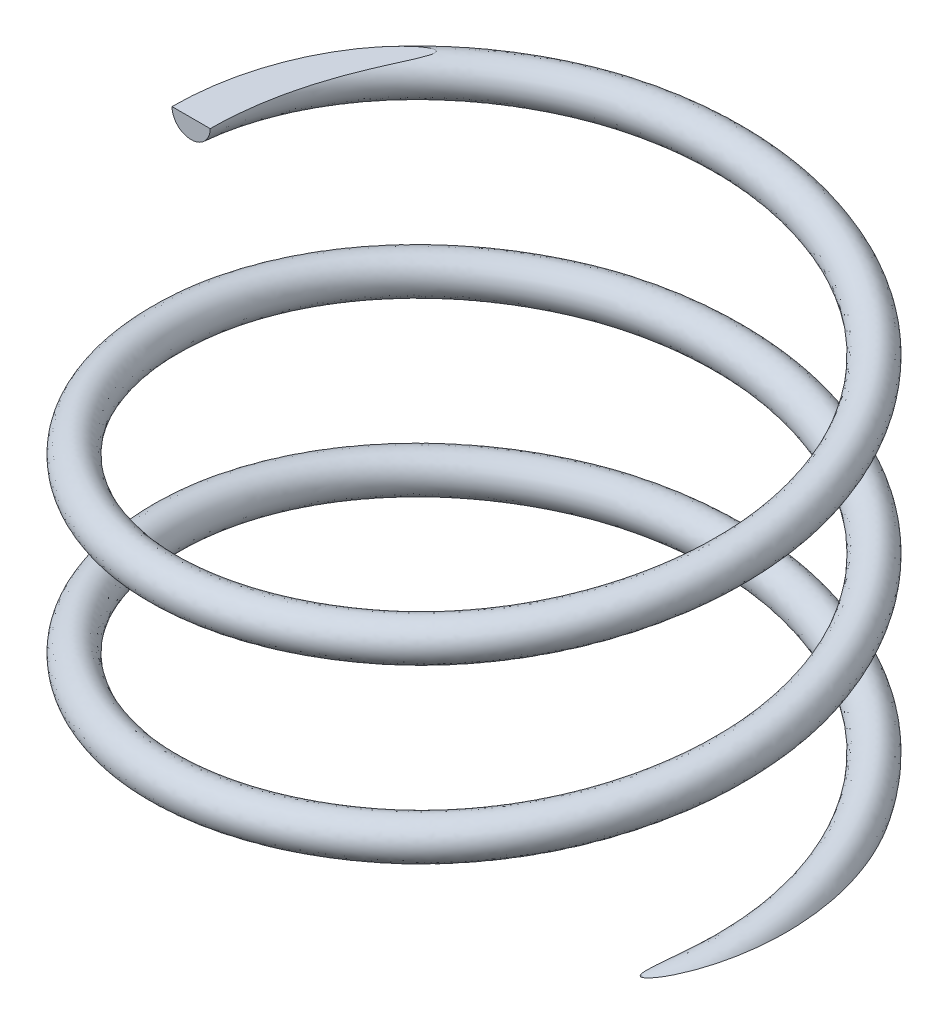
ISO-10303-21;
HEADER;
FILE_DESCRIPTION(('STEP AP214'),'2;1');
FILE_NAME('part.step','',(''),(''),'','','');
FILE_SCHEMA(('AUTOMOTIVE_DESIGN { 1 0 10303 214 1 1 1 1 }'));
ENDSEC;
DATA;
#1=APPLICATION_CONTEXT('core data for automotive mechanical design processes');
#2=APPLICATION_PROTOCOL_DEFINITION('international standard','automotive_design',2000,#1);
#3=PRODUCT_CONTEXT('',#1,'mechanical');
#4=PRODUCT('Part','Part','',(#3));
#5=PRODUCT_RELATED_PRODUCT_CATEGORY('part','',(#4));
#6=PRODUCT_DEFINITION_FORMATION('','',#4);
#7=PRODUCT_DEFINITION_CONTEXT('part definition',#1,'design');
#8=PRODUCT_DEFINITION('design','',#6,#7);
#9=PRODUCT_DEFINITION_SHAPE('','',#8);
#10=(LENGTH_UNIT() NAMED_UNIT(*) SI_UNIT(.MILLI.,.METRE.));
#11=(NAMED_UNIT(*) PLANE_ANGLE_UNIT() SI_UNIT($,.RADIAN.));
#12=(NAMED_UNIT(*) SI_UNIT($,.STERADIAN.) SOLID_ANGLE_UNIT());
#13=UNCERTAINTY_MEASURE_WITH_UNIT(LENGTH_MEASURE(1.E-05),#10,'distance_accuracy_value','');
#14=(GEOMETRIC_REPRESENTATION_CONTEXT(3) GLOBAL_UNCERTAINTY_ASSIGNED_CONTEXT((#13)) GLOBAL_UNIT_ASSIGNED_CONTEXT((#10,
#11,#12)) REPRESENTATION_CONTEXT('',''));
#15=CARTESIAN_POINT('',(0.,0.,0.));
#16=DIRECTION('',(0.,0.,1.));
#17=DIRECTION('',(1.,0.,0.));
#18=AXIS2_PLACEMENT_3D('',#15,#16,#17);
#19=CARTESIAN_POINT('',(0.,9.,2.06695695259513E-13));
#20=DIRECTION('',(0.,0.,1.));
#21=DIRECTION('',(1.,0.,0.));
#22=AXIS2_PLACEMENT_3D('',#19,#20,#21);
#23=PLANE('',#22);
#24=CARTESIAN_POINT('',(0.,9.,2.06695695259513E-13));
#25=DIRECTION('',(0.,0.,1.));
#26=DIRECTION('',(1.,0.,0.));
#27=AXIS2_PLACEMENT_3D('',#24,#25,#26);
#28=CIRCLE('',#27,0.25);
#29=CARTESIAN_POINT('',(-0.25,9.,0.));
#30=VERTEX_POINT('',#29);
#31=CARTESIAN_POINT('',(0.25,9.,1.92729769904141E-13));
#32=VERTEX_POINT('',#31);
#33=EDGE_CURVE('E65',#30,#32,#28,.T.);
#34=ORIENTED_EDGE('',*,*,#33,.T.);
#35=DIRECTION('',(-1.,0.,0.));
#36=VECTOR('',#35,1.);
#37=CARTESIAN_POINT('',(0.,9.,2.06695695259513E-13));
#38=LINE('',#37,#36);
#39=EDGE_CURVE('E59',#32,#30,#38,.T.);
#40=ORIENTED_EDGE('',*,*,#39,.T.);
#41=EDGE_LOOP('',(#34,#40));
#42=FACE_BOUND('',#41,.T.);
#43=ADVANCED_FACE('F42',(#42),#23,.T.);
#44=CARTESIAN_POINT('',(0.25,0.,0.));
#45=CARTESIAN_POINT('',(0.25,0.1875,1.99185842870421));
#46=CARTESIAN_POINT('',(1.975,0.374999999999999,2.98778764305631));
#47=CARTESIAN_POINT('',(3.7,0.562499999999999,3.98371685740842));
#48=CARTESIAN_POINT('',(5.425,0.749999999999998,2.98778764305631));
#49=CARTESIAN_POINT('',(7.15,0.937499999999998,1.99185842870421));
#50=CARTESIAN_POINT('',(7.15,1.125,0.));
#51=CARTESIAN_POINT('',(7.15,1.3125,-1.99185842870421));
#52=CARTESIAN_POINT('',(5.425,1.5,-2.98778764305631));
#53=CARTESIAN_POINT('',(3.7,1.6875,-3.98371685740842));
#54=CARTESIAN_POINT('',(1.975,1.875,-2.98778764305631));
#55=CARTESIAN_POINT('',(0.250000000000001,2.06249999999999,-1.99185842870421));
#56=CARTESIAN_POINT('',(0.25,2.24999999999999,0.));
#57=CARTESIAN_POINT('',(0.25,2.43749999999999,1.99185842870421));
#58=CARTESIAN_POINT('',(1.975,2.62499999999999,2.98778764305631));
#59=CARTESIAN_POINT('',(3.7,2.81249999999999,3.98371685740842));
#60=CARTESIAN_POINT('',(5.425,2.99999999999999,2.98778764305631));
#61=CARTESIAN_POINT('',(7.15,3.18749999999999,1.99185842870421));
#62=CARTESIAN_POINT('',(7.15,3.37499999999999,0.));
#63=CARTESIAN_POINT('',(7.15,3.56249999999999,-1.99185842870421));
#64=CARTESIAN_POINT('',(5.425,3.74999999999999,-2.98778764305631));
#65=CARTESIAN_POINT('',(3.7,3.93749999999999,-3.98371685740842));
#66=CARTESIAN_POINT('',(1.975,4.12499999999999,-2.98778764305631));
#67=CARTESIAN_POINT('',(0.250000000000001,4.31249999999999,-1.99185842870421));
#68=CARTESIAN_POINT('',(0.25,4.49999999999999,0.));
#69=CARTESIAN_POINT('',(0.25,4.68749999999999,1.99185842870421));
#70=CARTESIAN_POINT('',(1.975,4.87499999999999,2.98778764305631));
#71=CARTESIAN_POINT('',(3.7,5.06249999999999,3.98371685740842));
#72=CARTESIAN_POINT('',(5.425,5.24999999999999,2.98778764305631));
#73=CARTESIAN_POINT('',(7.15,5.43749999999999,1.99185842870421));
#74=CARTESIAN_POINT('',(7.15,5.62499999999999,0.));
#75=CARTESIAN_POINT('',(7.15,5.81249999999999,-1.99185842870421));
#76=CARTESIAN_POINT('',(5.425,5.99999999999999,-2.98778764305631));
#77=CARTESIAN_POINT('',(3.7,6.18749999999998,-3.98371685740842));
#78=CARTESIAN_POINT('',(1.975,6.37499999999998,-2.98778764305631));
#79=CARTESIAN_POINT('',(0.250000000000001,6.56249999999998,-1.99185842870421));
#80=CARTESIAN_POINT('',(0.25,6.74999999999998,0.));
#81=CARTESIAN_POINT('',(0.25,6.93749999999998,1.99185842870421));
#82=CARTESIAN_POINT('',(1.975,7.12499999999998,2.98778764305631));
#83=CARTESIAN_POINT('',(3.7,7.31249999999998,3.98371685740842));
#84=CARTESIAN_POINT('',(5.425,7.49999999999998,2.98778764305631));
#85=CARTESIAN_POINT('',(7.15,7.68749999999998,1.99185842870421));
#86=CARTESIAN_POINT('',(7.15,7.87499999999998,0.));
#87=CARTESIAN_POINT('',(7.15,8.06249999999998,-1.99185842870421));
#88=CARTESIAN_POINT('',(5.425,8.24999999999998,-2.98778764305631));
#89=CARTESIAN_POINT('',(3.7,8.43749999999998,-3.98371685740842));
#90=CARTESIAN_POINT('',(1.975,8.62499999999998,-2.98778764305631));
#91=CARTESIAN_POINT('',(0.250000000000001,8.81249999999998,-1.99185842870421));
#92=CARTESIAN_POINT('',(0.25,8.99999999999998,0.));
#93=CARTESIAN_POINT('',(0.25,0.5,0.));
#94=CARTESIAN_POINT('',(0.25,0.687499999999999,1.99185842870421));
#95=CARTESIAN_POINT('',(1.975,0.874999999999999,2.98778764305631));
#96=CARTESIAN_POINT('',(3.7,1.0625,3.98371685740842));
#97=CARTESIAN_POINT('',(5.425,1.25,2.98778764305631));
#98=CARTESIAN_POINT('',(7.15,1.4375,1.99185842870421));
#99=CARTESIAN_POINT('',(7.15,1.625,0.));
#100=CARTESIAN_POINT('',(7.15,1.8125,-1.99185842870421));
#101=CARTESIAN_POINT('',(5.425,2.,-2.98778764305631));
#102=CARTESIAN_POINT('',(3.7,2.1875,-3.98371685740842));
#103=CARTESIAN_POINT('',(1.975,2.375,-2.98778764305631));
#104=CARTESIAN_POINT('',(0.250000000000001,2.5625,-1.99185842870421));
#105=CARTESIAN_POINT('',(0.25,2.74999999999999,0.));
#106=CARTESIAN_POINT('',(0.25,2.93749999999999,1.99185842870421));
#107=CARTESIAN_POINT('',(1.975,3.12499999999999,2.98778764305631));
#108=CARTESIAN_POINT('',(3.7,3.31249999999999,3.98371685740842));
#109=CARTESIAN_POINT('',(5.425,3.49999999999999,2.98778764305631));
#110=CARTESIAN_POINT('',(7.15,3.68749999999999,1.99185842870421));
#111=CARTESIAN_POINT('',(7.15,3.87499999999999,0.));
#112=CARTESIAN_POINT('',(7.15,4.06249999999999,-1.99185842870421));
#113=CARTESIAN_POINT('',(5.425,4.24999999999999,-2.98778764305631));
#114=CARTESIAN_POINT('',(3.7,4.43749999999999,-3.98371685740842));
#115=CARTESIAN_POINT('',(1.975,4.62499999999999,-2.98778764305631));
#116=CARTESIAN_POINT('',(0.250000000000001,4.81249999999999,-1.99185842870421));
#117=CARTESIAN_POINT('',(0.25,4.99999999999999,0.));
#118=CARTESIAN_POINT('',(0.25,5.18749999999999,1.99185842870421));
#119=CARTESIAN_POINT('',(1.975,5.37499999999999,2.98778764305631));
#120=CARTESIAN_POINT('',(3.7,5.56249999999999,3.98371685740842));
#121=CARTESIAN_POINT('',(5.425,5.74999999999999,2.98778764305631));
#122=CARTESIAN_POINT('',(7.15,5.93749999999999,1.99185842870421));
#123=CARTESIAN_POINT('',(7.15,6.12499999999999,0.));
#124=CARTESIAN_POINT('',(7.15,6.31249999999999,-1.99185842870421));
#125=CARTESIAN_POINT('',(5.425,6.49999999999998,-2.98778764305631));
#126=CARTESIAN_POINT('',(3.7,6.68749999999998,-3.98371685740842));
#127=CARTESIAN_POINT('',(1.975,6.87499999999998,-2.98778764305631));
#128=CARTESIAN_POINT('',(0.250000000000001,7.06249999999998,-1.99185842870421));
#129=CARTESIAN_POINT('',(0.25,7.24999999999998,0.));
#130=CARTESIAN_POINT('',(0.25,7.43749999999998,1.99185842870421));
#131=CARTESIAN_POINT('',(1.975,7.62499999999998,2.98778764305631));
#132=CARTESIAN_POINT('',(3.7,7.81249999999998,3.98371685740842));
#133=CARTESIAN_POINT('',(5.425,7.99999999999998,2.98778764305631));
#134=CARTESIAN_POINT('',(7.15,8.18749999999998,1.99185842870421));
#135=CARTESIAN_POINT('',(7.15,8.37499999999998,0.));
#136=CARTESIAN_POINT('',(7.15,8.56249999999998,-1.99185842870421));
#137=CARTESIAN_POINT('',(5.425,8.74999999999998,-2.98778764305631));
#138=CARTESIAN_POINT('',(3.7,8.93749999999998,-3.98371685740842));
#139=CARTESIAN_POINT('',(1.975,9.12499999999998,-2.98778764305631));
#140=CARTESIAN_POINT('',(0.250000000000001,9.31249999999998,-1.99185842870421));
#141=CARTESIAN_POINT('',(0.25,9.49999999999998,0.));
#142=CARTESIAN_POINT('',(-0.25,0.5,0.));
#143=CARTESIAN_POINT('',(-0.25,0.687499999999999,2.28053356329902));
#144=CARTESIAN_POINT('',(1.725,0.874999999999999,3.42080034494853));
#145=CARTESIAN_POINT('',(3.7,1.0625,4.56106712659804));
#146=CARTESIAN_POINT('',(5.675,1.25,3.42080034494853));
#147=CARTESIAN_POINT('',(7.65,1.4375,2.28053356329902));
#148=CARTESIAN_POINT('',(7.65,1.625,0.));
#149=CARTESIAN_POINT('',(7.65,1.8125,-2.28053356329902));
#150=CARTESIAN_POINT('',(5.675,2.,-3.42080034494853));
#151=CARTESIAN_POINT('',(3.7,2.1875,-4.56106712659804));
#152=CARTESIAN_POINT('',(1.725,2.375,-3.42080034494853));
#153=CARTESIAN_POINT('',(-0.249999999999999,2.5625,-2.28053356329902));
#154=CARTESIAN_POINT('',(-0.25,2.74999999999999,0.));
#155=CARTESIAN_POINT('',(-0.25,2.93749999999999,2.28053356329902));
#156=CARTESIAN_POINT('',(1.725,3.12499999999999,3.42080034494853));
#157=CARTESIAN_POINT('',(3.7,3.31249999999999,4.56106712659804));
#158=CARTESIAN_POINT('',(5.675,3.49999999999999,3.42080034494853));
#159=CARTESIAN_POINT('',(7.65,3.68749999999999,2.28053356329902));
#160=CARTESIAN_POINT('',(7.65,3.87499999999999,0.));
#161=CARTESIAN_POINT('',(7.65,4.06249999999999,-2.28053356329902));
#162=CARTESIAN_POINT('',(5.675,4.24999999999999,-3.42080034494853));
#163=CARTESIAN_POINT('',(3.7,4.43749999999999,-4.56106712659804));
#164=CARTESIAN_POINT('',(1.725,4.62499999999999,-3.42080034494853));
#165=CARTESIAN_POINT('',(-0.249999999999999,4.81249999999999,-2.28053356329902));
#166=CARTESIAN_POINT('',(-0.25,4.99999999999999,0.));
#167=CARTESIAN_POINT('',(-0.25,5.18749999999999,2.28053356329902));
#168=CARTESIAN_POINT('',(1.725,5.37499999999999,3.42080034494853));
#169=CARTESIAN_POINT('',(3.7,5.56249999999999,4.56106712659804));
#170=CARTESIAN_POINT('',(5.675,5.74999999999999,3.42080034494853));
#171=CARTESIAN_POINT('',(7.65,5.93749999999999,2.28053356329902));
#172=CARTESIAN_POINT('',(7.65,6.12499999999999,0.));
#173=CARTESIAN_POINT('',(7.65,6.31249999999999,-2.28053356329902));
#174=CARTESIAN_POINT('',(5.675,6.49999999999998,-3.42080034494853));
#175=CARTESIAN_POINT('',(3.7,6.68749999999998,-4.56106712659804));
#176=CARTESIAN_POINT('',(1.725,6.87499999999998,-3.42080034494853));
#177=CARTESIAN_POINT('',(-0.249999999999999,7.06249999999998,-2.28053356329902));
#178=CARTESIAN_POINT('',(-0.25,7.24999999999998,0.));
#179=CARTESIAN_POINT('',(-0.25,7.43749999999998,2.28053356329902));
#180=CARTESIAN_POINT('',(1.725,7.62499999999998,3.42080034494853));
#181=CARTESIAN_POINT('',(3.7,7.81249999999998,4.56106712659804));
#182=CARTESIAN_POINT('',(5.675,7.99999999999998,3.42080034494853));
#183=CARTESIAN_POINT('',(7.65,8.18749999999998,2.28053356329902));
#184=CARTESIAN_POINT('',(7.65,8.37499999999998,0.));
#185=CARTESIAN_POINT('',(7.65,8.56249999999998,-2.28053356329902));
#186=CARTESIAN_POINT('',(5.675,8.74999999999998,-3.42080034494853));
#187=CARTESIAN_POINT('',(3.7,8.93749999999998,-4.56106712659804));
#188=CARTESIAN_POINT('',(1.725,9.12499999999998,-3.42080034494853));
#189=CARTESIAN_POINT('',(-0.249999999999999,9.31249999999998,-2.28053356329902));
#190=CARTESIAN_POINT('',(-0.25,9.49999999999998,0.));
#191=CARTESIAN_POINT('',(-0.25,0.,0.));
#192=CARTESIAN_POINT('',(-0.25,0.1875,2.28053356329902));
#193=CARTESIAN_POINT('',(1.725,0.374999999999999,3.42080034494853));
#194=CARTESIAN_POINT('',(3.7,0.562499999999999,4.56106712659804));
#195=CARTESIAN_POINT('',(5.675,0.749999999999998,3.42080034494853));
#196=CARTESIAN_POINT('',(7.65,0.937499999999998,2.28053356329902));
#197=CARTESIAN_POINT('',(7.65,1.125,0.));
#198=CARTESIAN_POINT('',(7.65,1.3125,-2.28053356329902));
#199=CARTESIAN_POINT('',(5.675,1.5,-3.42080034494853));
#200=CARTESIAN_POINT('',(3.7,1.6875,-4.56106712659804));
#201=CARTESIAN_POINT('',(1.725,1.875,-3.42080034494853));
#202=CARTESIAN_POINT('',(-0.249999999999999,2.06249999999999,-2.28053356329902));
#203=CARTESIAN_POINT('',(-0.25,2.24999999999999,0.));
#204=CARTESIAN_POINT('',(-0.25,2.43749999999999,2.28053356329902));
#205=CARTESIAN_POINT('',(1.725,2.62499999999999,3.42080034494853));
#206=CARTESIAN_POINT('',(3.7,2.81249999999999,4.56106712659804));
#207=CARTESIAN_POINT('',(5.675,2.99999999999999,3.42080034494853));
#208=CARTESIAN_POINT('',(7.65,3.18749999999999,2.28053356329902));
#209=CARTESIAN_POINT('',(7.65,3.37499999999999,0.));
#210=CARTESIAN_POINT('',(7.65,3.56249999999999,-2.28053356329902));
#211=CARTESIAN_POINT('',(5.675,3.74999999999999,-3.42080034494853));
#212=CARTESIAN_POINT('',(3.7,3.93749999999999,-4.56106712659804));
#213=CARTESIAN_POINT('',(1.725,4.12499999999999,-3.42080034494853));
#214=CARTESIAN_POINT('',(-0.249999999999999,4.31249999999999,-2.28053356329902));
#215=CARTESIAN_POINT('',(-0.25,4.49999999999999,0.));
#216=CARTESIAN_POINT('',(-0.25,4.68749999999999,2.28053356329902));
#217=CARTESIAN_POINT('',(1.725,4.87499999999999,3.42080034494853));
#218=CARTESIAN_POINT('',(3.7,5.06249999999999,4.56106712659804));
#219=CARTESIAN_POINT('',(5.675,5.24999999999999,3.42080034494853));
#220=CARTESIAN_POINT('',(7.65,5.43749999999999,2.28053356329902));
#221=CARTESIAN_POINT('',(7.65,5.62499999999999,0.));
#222=CARTESIAN_POINT('',(7.65,5.81249999999999,-2.28053356329902));
#223=CARTESIAN_POINT('',(5.675,5.99999999999999,-3.42080034494853));
#224=CARTESIAN_POINT('',(3.7,6.18749999999998,-4.56106712659804));
#225=CARTESIAN_POINT('',(1.725,6.37499999999998,-3.42080034494853));
#226=CARTESIAN_POINT('',(-0.249999999999999,6.56249999999998,-2.28053356329902));
#227=CARTESIAN_POINT('',(-0.25,6.74999999999998,0.));
#228=CARTESIAN_POINT('',(-0.25,6.93749999999998,2.28053356329902));
#229=CARTESIAN_POINT('',(1.725,7.12499999999998,3.42080034494853));
#230=CARTESIAN_POINT('',(3.7,7.31249999999998,4.56106712659804));
#231=CARTESIAN_POINT('',(5.675,7.49999999999998,3.42080034494853));
#232=CARTESIAN_POINT('',(7.65,7.68749999999998,2.28053356329902));
#233=CARTESIAN_POINT('',(7.65,7.87499999999998,0.));
#234=CARTESIAN_POINT('',(7.65,8.06249999999998,-2.28053356329902));
#235=CARTESIAN_POINT('',(5.675,8.24999999999998,-3.42080034494853));
#236=CARTESIAN_POINT('',(3.7,8.43749999999998,-4.56106712659804));
#237=CARTESIAN_POINT('',(1.725,8.62499999999998,-3.42080034494853));
#238=CARTESIAN_POINT('',(-0.249999999999999,8.81249999999998,-2.28053356329902));
#239=CARTESIAN_POINT('',(-0.25,8.99999999999998,0.));
#240=CARTESIAN_POINT('',(-0.25,-0.5,0.));
#241=CARTESIAN_POINT('',(-0.25,-0.3125,2.28053356329902));
#242=CARTESIAN_POINT('',(1.725,-0.125000000000001,3.42080034494853));
#243=CARTESIAN_POINT('',(3.7,0.0624999999999988,4.56106712659804));
#244=CARTESIAN_POINT('',(5.675,0.249999999999998,3.42080034494853));
#245=CARTESIAN_POINT('',(7.65,0.437499999999998,2.28053356329902));
#246=CARTESIAN_POINT('',(7.65,0.624999999999997,0.));
#247=CARTESIAN_POINT('',(7.65,0.812499999999997,-2.28053356329902));
#248=CARTESIAN_POINT('',(5.675,0.999999999999997,-3.42080034494853));
#249=CARTESIAN_POINT('',(3.7,1.1875,-4.56106712659804));
#250=CARTESIAN_POINT('',(1.725,1.375,-3.42080034494853));
#251=CARTESIAN_POINT('',(-0.249999999999999,1.5625,-2.28053356329902));
#252=CARTESIAN_POINT('',(-0.25,1.74999999999999,0.));
#253=CARTESIAN_POINT('',(-0.25,1.93749999999999,2.28053356329902));
#254=CARTESIAN_POINT('',(1.725,2.12499999999999,3.42080034494853));
#255=CARTESIAN_POINT('',(3.7,2.31249999999999,4.56106712659804));
#256=CARTESIAN_POINT('',(5.675,2.49999999999999,3.42080034494853));
#257=CARTESIAN_POINT('',(7.65,2.68749999999999,2.28053356329902));
#258=CARTESIAN_POINT('',(7.65,2.87499999999999,0.));
#259=CARTESIAN_POINT('',(7.65,3.06249999999999,-2.28053356329902));
#260=CARTESIAN_POINT('',(5.675,3.24999999999999,-3.42080034494853));
#261=CARTESIAN_POINT('',(3.7,3.43749999999999,-4.56106712659804));
#262=CARTESIAN_POINT('',(1.725,3.62499999999999,-3.42080034494853));
#263=CARTESIAN_POINT('',(-0.249999999999999,3.81249999999999,-2.28053356329902));
#264=CARTESIAN_POINT('',(-0.25,3.99999999999999,0.));
#265=CARTESIAN_POINT('',(-0.25,4.18749999999999,2.28053356329902));
#266=CARTESIAN_POINT('',(1.725,4.37499999999999,3.42080034494853));
#267=CARTESIAN_POINT('',(3.7,4.56249999999999,4.56106712659804));
#268=CARTESIAN_POINT('',(5.675,4.74999999999999,3.42080034494853));
#269=CARTESIAN_POINT('',(7.65,4.93749999999999,2.28053356329902));
#270=CARTESIAN_POINT('',(7.65,5.12499999999999,0.));
#271=CARTESIAN_POINT('',(7.65,5.31249999999999,-2.28053356329902));
#272=CARTESIAN_POINT('',(5.675,5.49999999999999,-3.42080034494853));
#273=CARTESIAN_POINT('',(3.7,5.68749999999998,-4.56106712659804));
#274=CARTESIAN_POINT('',(1.725,5.87499999999999,-3.42080034494853));
#275=CARTESIAN_POINT('',(-0.249999999999999,6.06249999999999,-2.28053356329902));
#276=CARTESIAN_POINT('',(-0.25,6.24999999999998,0.));
#277=CARTESIAN_POINT('',(-0.25,6.43749999999998,2.28053356329902));
#278=CARTESIAN_POINT('',(1.725,6.62499999999998,3.42080034494853));
#279=CARTESIAN_POINT('',(3.7,6.81249999999998,4.56106712659804));
#280=CARTESIAN_POINT('',(5.675,6.99999999999998,3.42080034494853));
#281=CARTESIAN_POINT('',(7.65,7.18749999999998,2.28053356329902));
#282=CARTESIAN_POINT('',(7.65,7.37499999999998,0.));
#283=CARTESIAN_POINT('',(7.65,7.56249999999998,-2.28053356329902));
#284=CARTESIAN_POINT('',(5.675,7.74999999999998,-3.42080034494853));
#285=CARTESIAN_POINT('',(3.7,7.93749999999998,-4.56106712659804));
#286=CARTESIAN_POINT('',(1.725,8.12499999999998,-3.42080034494853));
#287=CARTESIAN_POINT('',(-0.249999999999999,8.31249999999998,-2.28053356329902));
#288=CARTESIAN_POINT('',(-0.25,8.49999999999998,0.));
#289=CARTESIAN_POINT('',(0.25,-0.5,0.));
#290=CARTESIAN_POINT('',(0.25,-0.3125,1.99185842870421));
#291=CARTESIAN_POINT('',(1.975,-0.125000000000001,2.98778764305631));
#292=CARTESIAN_POINT('',(3.7,0.0624999999999988,3.98371685740842));
#293=CARTESIAN_POINT('',(5.425,0.249999999999998,2.98778764305631));
#294=CARTESIAN_POINT('',(7.15,0.437499999999998,1.99185842870421));
#295=CARTESIAN_POINT('',(7.15,0.624999999999997,0.));
#296=CARTESIAN_POINT('',(7.15,0.812499999999997,-1.99185842870421));
#297=CARTESIAN_POINT('',(5.425,0.999999999999997,-2.98778764305631));
#298=CARTESIAN_POINT('',(3.7,1.1875,-3.98371685740842));
#299=CARTESIAN_POINT('',(1.975,1.375,-2.98778764305631));
#300=CARTESIAN_POINT('',(0.250000000000001,1.5625,-1.99185842870421));
#301=CARTESIAN_POINT('',(0.25,1.74999999999999,0.));
#302=CARTESIAN_POINT('',(0.25,1.93749999999999,1.99185842870421));
#303=CARTESIAN_POINT('',(1.975,2.12499999999999,2.98778764305631));
#304=CARTESIAN_POINT('',(3.7,2.31249999999999,3.98371685740842));
#305=CARTESIAN_POINT('',(5.425,2.49999999999999,2.98778764305631));
#306=CARTESIAN_POINT('',(7.15,2.68749999999999,1.99185842870421));
#307=CARTESIAN_POINT('',(7.15,2.87499999999999,0.));
#308=CARTESIAN_POINT('',(7.15,3.06249999999999,-1.99185842870421));
#309=CARTESIAN_POINT('',(5.425,3.24999999999999,-2.98778764305631));
#310=CARTESIAN_POINT('',(3.7,3.43749999999999,-3.98371685740842));
#311=CARTESIAN_POINT('',(1.975,3.62499999999999,-2.98778764305631));
#312=CARTESIAN_POINT('',(0.250000000000001,3.81249999999999,-1.99185842870421));
#313=CARTESIAN_POINT('',(0.25,3.99999999999999,0.));
#314=CARTESIAN_POINT('',(0.25,4.18749999999999,1.99185842870421));
#315=CARTESIAN_POINT('',(1.975,4.37499999999999,2.98778764305631));
#316=CARTESIAN_POINT('',(3.7,4.56249999999999,3.98371685740842));
#317=CARTESIAN_POINT('',(5.425,4.74999999999999,2.98778764305631));
#318=CARTESIAN_POINT('',(7.15,4.93749999999999,1.99185842870421));
#319=CARTESIAN_POINT('',(7.15,5.12499999999999,0.));
#320=CARTESIAN_POINT('',(7.15,5.31249999999999,-1.99185842870421));
#321=CARTESIAN_POINT('',(5.425,5.49999999999999,-2.98778764305631));
#322=CARTESIAN_POINT('',(3.7,5.68749999999998,-3.98371685740842));
#323=CARTESIAN_POINT('',(1.975,5.87499999999999,-2.98778764305631));
#324=CARTESIAN_POINT('',(0.250000000000001,6.06249999999999,-1.99185842870421));
#325=CARTESIAN_POINT('',(0.25,6.24999999999998,0.));
#326=CARTESIAN_POINT('',(0.25,6.43749999999998,1.99185842870421));
#327=CARTESIAN_POINT('',(1.975,6.62499999999998,2.98778764305631));
#328=CARTESIAN_POINT('',(3.7,6.81249999999998,3.98371685740842));
#329=CARTESIAN_POINT('',(5.425,6.99999999999998,2.98778764305631));
#330=CARTESIAN_POINT('',(7.15,7.18749999999998,1.99185842870421));
#331=CARTESIAN_POINT('',(7.15,7.37499999999998,0.));
#332=CARTESIAN_POINT('',(7.15,7.56249999999998,-1.99185842870421));
#333=CARTESIAN_POINT('',(5.425,7.74999999999998,-2.98778764305631));
#334=CARTESIAN_POINT('',(3.7,7.93749999999998,-3.98371685740842));
#335=CARTESIAN_POINT('',(1.975,8.12499999999998,-2.98778764305631));
#336=CARTESIAN_POINT('',(0.250000000000001,8.31249999999998,-1.99185842870421));
#337=CARTESIAN_POINT('',(0.25,8.49999999999998,0.));
#338=CARTESIAN_POINT('',(0.25,0.,0.));
#339=CARTESIAN_POINT('',(0.25,0.1875,1.99185842870421));
#340=CARTESIAN_POINT('',(1.975,0.374999999999999,2.98778764305631));
#341=CARTESIAN_POINT('',(3.7,0.562499999999999,3.98371685740842));
#342=CARTESIAN_POINT('',(5.425,0.749999999999998,2.98778764305631));
#343=CARTESIAN_POINT('',(7.15,0.937499999999998,1.99185842870421));
#344=CARTESIAN_POINT('',(7.15,1.125,0.));
#345=CARTESIAN_POINT('',(7.15,1.3125,-1.99185842870421));
#346=CARTESIAN_POINT('',(5.425,1.5,-2.98778764305631));
#347=CARTESIAN_POINT('',(3.7,1.6875,-3.98371685740842));
#348=CARTESIAN_POINT('',(1.975,1.875,-2.98778764305631));
#349=CARTESIAN_POINT('',(0.250000000000001,2.06249999999999,-1.99185842870421));
#350=CARTESIAN_POINT('',(0.25,2.24999999999999,0.));
#351=CARTESIAN_POINT('',(0.25,2.43749999999999,1.99185842870421));
#352=CARTESIAN_POINT('',(1.975,2.62499999999999,2.98778764305631));
#353=CARTESIAN_POINT('',(3.7,2.81249999999999,3.98371685740842));
#354=CARTESIAN_POINT('',(5.425,2.99999999999999,2.98778764305631));
#355=CARTESIAN_POINT('',(7.15,3.18749999999999,1.99185842870421));
#356=CARTESIAN_POINT('',(7.15,3.37499999999999,0.));
#357=CARTESIAN_POINT('',(7.15,3.56249999999999,-1.99185842870421));
#358=CARTESIAN_POINT('',(5.425,3.74999999999999,-2.98778764305631));
#359=CARTESIAN_POINT('',(3.7,3.93749999999999,-3.98371685740842));
#360=CARTESIAN_POINT('',(1.975,4.12499999999999,-2.98778764305631));
#361=CARTESIAN_POINT('',(0.250000000000001,4.31249999999999,-1.99185842870421));
#362=CARTESIAN_POINT('',(0.25,4.49999999999999,0.));
#363=CARTESIAN_POINT('',(0.25,4.68749999999999,1.99185842870421));
#364=CARTESIAN_POINT('',(1.975,4.87499999999999,2.98778764305631));
#365=CARTESIAN_POINT('',(3.7,5.06249999999999,3.98371685740842));
#366=CARTESIAN_POINT('',(5.425,5.24999999999999,2.98778764305631));
#367=CARTESIAN_POINT('',(7.15,5.43749999999999,1.99185842870421));
#368=CARTESIAN_POINT('',(7.15,5.62499999999999,0.));
#369=CARTESIAN_POINT('',(7.15,5.81249999999999,-1.99185842870421));
#370=CARTESIAN_POINT('',(5.425,5.99999999999999,-2.98778764305631));
#371=CARTESIAN_POINT('',(3.7,6.18749999999998,-3.98371685740842));
#372=CARTESIAN_POINT('',(1.975,6.37499999999998,-2.98778764305631));
#373=CARTESIAN_POINT('',(0.250000000000001,6.56249999999998,-1.99185842870421));
#374=CARTESIAN_POINT('',(0.25,6.74999999999998,0.));
#375=CARTESIAN_POINT('',(0.25,6.93749999999998,1.99185842870421));
#376=CARTESIAN_POINT('',(1.975,7.12499999999998,2.98778764305631));
#377=CARTESIAN_POINT('',(3.7,7.31249999999998,3.98371685740842));
#378=CARTESIAN_POINT('',(5.425,7.49999999999998,2.98778764305631));
#379=CARTESIAN_POINT('',(7.15,7.68749999999998,1.99185842870421));
#380=CARTESIAN_POINT('',(7.15,7.87499999999998,0.));
#381=CARTESIAN_POINT('',(7.15,8.06249999999998,-1.99185842870421));
#382=CARTESIAN_POINT('',(5.425,8.24999999999998,-2.98778764305631));
#383=CARTESIAN_POINT('',(3.7,8.43749999999998,-3.98371685740842));
#384=CARTESIAN_POINT('',(1.975,8.62499999999998,-2.98778764305631));
#385=CARTESIAN_POINT('',(0.250000000000001,8.81249999999998,-1.99185842870421));
#386=CARTESIAN_POINT('',(0.25,8.99999999999998,0.));
#387=(BOUNDED_SURFACE() B_SPLINE_SURFACE(3,2,((#44,#45,#46,#47,#48,#49,#50,#51,#52,#53,#54,#55,
#56,#57,#58,#59,#60,#61,#62,#63,#64,#65,#66,#67,#68,#69,#70,#71,#72,#73,#74,#75,#76,#77,#78,#79,
#80,#81,#82,#83,#84,#85,#86,#87,#88,#89,#90,#91,#92),(#93,#94,#95,#96,#97,#98,#99,#100,#101,
#102,#103,#104,#105,#106,#107,#108,#109,#110,#111,#112,#113,#114,#115,#116,#117,#118,#119,#120,
#121,#122,#123,#124,#125,#126,#127,#128,#129,#130,#131,#132,#133,#134,#135,#136,#137,#138,#139,
#140,#141),(#142,#143,#144,#145,#146,#147,#148,#149,#150,#151,#152,#153,#154,#155,#156,#157,
#158,#159,#160,#161,#162,#163,#164,#165,#166,#167,#168,#169,#170,#171,#172,#173,#174,#175,#176,
#177,#178,#179,#180,#181,#182,#183,#184,#185,#186,#187,#188,#189,#190),(#191,#192,#193,#194,
#195,#196,#197,#198,#199,#200,#201,#202,#203,#204,#205,#206,#207,#208,#209,#210,#211,#212,#213,
#214,#215,#216,#217,#218,#219,#220,#221,#222,#223,#224,#225,#226,#227,#228,#229,#230,#231,#232,
#233,#234,#235,#236,#237,#238,#239),(#240,#241,#242,#243,#244,#245,#246,#247,#248,#249,#250,
#251,#252,#253,#254,#255,#256,#257,#258,#259,#260,#261,#262,#263,#264,#265,#266,#267,#268,#269,
#270,#271,#272,#273,#274,#275,#276,#277,#278,#279,#280,#281,#282,#283,#284,#285,#286,#287,#288),
(#289,#290,#291,#292,#293,#294,#295,#296,#297,#298,#299,#300,#301,#302,#303,#304,#305,#306,#307,
#308,#309,#310,#311,#312,#313,#314,#315,#316,#317,#318,#319,#320,#321,#322,#323,#324,#325,#326,
#327,#328,#329,#330,#331,#332,#333,#334,#335,#336,#337),(#338,#339,#340,#341,#342,#343,#344,
#345,#346,#347,#348,#349,#350,#351,#352,#353,#354,#355,#356,#357,#358,#359,#360,#361,#362,#363,
#364,#365,#366,#367,#368,#369,#370,#371,#372,#373,#374,#375,#376,#377,#378,#379,#380,#381,#382,
#383,#384,#385,#386)),.UNSPECIFIED.,.T.,.F.,.F.) B_SPLINE_SURFACE_WITH_KNOTS((4,3,4),(3,2,2,2,2,
2,2,2,2,2,2,2,2,2,2,2,2,2,2,2,2,2,2,2,3),(0.,0.5,1.),(0.,0.0416666666666667,0.0833333333333333,
0.125,0.166666666666667,0.208333333333333,0.25,0.291666666666667,0.333333333333333,0.375,
0.416666666666667,0.458333333333333,0.5,0.541666666666667,0.583333333333333,0.625,
0.666666666666667,0.708333333333333,0.75,0.791666666666667,0.833333333333333,0.875,
0.916666666666667,0.958333333333333,1.),
.UNSPECIFIED.) GEOMETRIC_REPRESENTATION_ITEM() RATIONAL_B_SPLINE_SURFACE(((1.,0.866025403784439,
1.,0.866025403784439,1.,0.866025403784439,1.,0.866025403784439,1.,0.866025403784439,1.,
0.866025403784439,1.,0.866025403784439,1.,0.866025403784439,1.,0.866025403784439,1.,
0.866025403784439,1.,0.866025403784439,1.,0.866025403784439,1.,0.866025403784439,1.,
0.866025403784439,1.,0.866025403784439,1.,0.866025403784439,1.,0.866025403784439,1.,
0.866025403784439,1.,0.866025403784439,1.,0.866025403784439,1.,0.866025403784439,1.,
0.866025403784439,1.,0.866025403784439,1.,0.866025403784439,1.),(0.333333333333333,
0.288675134594813,0.333333333333333,0.288675134594813,0.333333333333333,0.288675134594813,
0.333333333333333,0.288675134594813,0.333333333333333,0.288675134594813,0.333333333333333,
0.288675134594813,0.333333333333333,0.288675134594813,0.333333333333333,0.288675134594813,
0.333333333333333,0.288675134594813,0.333333333333333,0.288675134594813,0.333333333333333,
0.288675134594813,0.333333333333333,0.288675134594813,0.333333333333333,0.288675134594813,
0.333333333333333,0.288675134594813,0.333333333333333,0.288675134594813,0.333333333333333,
0.288675134594813,0.333333333333333,0.288675134594813,0.333333333333333,0.288675134594813,
0.333333333333333,0.288675134594813,0.333333333333333,0.288675134594813,0.333333333333333,
0.288675134594813,0.333333333333333,0.288675134594813,0.333333333333333,0.288675134594813,
0.333333333333333,0.288675134594813,0.333333333333333),(0.333333333333333,0.288675134594813,
0.333333333333333,0.288675134594813,0.333333333333333,0.288675134594813,0.333333333333333,
0.288675134594813,0.333333333333333,0.288675134594813,0.333333333333333,0.288675134594813,
0.333333333333333,0.288675134594813,0.333333333333333,0.288675134594813,0.333333333333333,
0.288675134594813,0.333333333333333,0.288675134594813,0.333333333333333,0.288675134594813,
0.333333333333333,0.288675134594813,0.333333333333333,0.288675134594813,0.333333333333333,
0.288675134594813,0.333333333333333,0.288675134594813,0.333333333333333,0.288675134594813,
0.333333333333333,0.288675134594813,0.333333333333333,0.288675134594813,0.333333333333333,
0.288675134594813,0.333333333333333,0.288675134594813,0.333333333333333,0.288675134594813,
0.333333333333333,0.288675134594813,0.333333333333333,0.288675134594813,0.333333333333333,
0.288675134594813,0.333333333333333),(1.,0.866025403784439,1.,0.866025403784439,1.,
0.866025403784439,1.,0.866025403784439,1.,0.866025403784439,1.,0.866025403784439,1.,
0.866025403784439,1.,0.866025403784439,1.,0.866025403784439,1.,0.866025403784439,1.,
0.866025403784439,1.,0.866025403784439,1.,0.866025403784439,1.,0.866025403784439,1.,
0.866025403784439,1.,0.866025403784439,1.,0.866025403784439,1.,0.866025403784439,1.,
0.866025403784439,1.,0.866025403784439,1.,0.866025403784439,1.,0.866025403784439,1.,
0.866025403784439,1.,0.866025403784439,1.),(0.333333333333333,0.288675134594813,
0.333333333333333,0.288675134594813,0.333333333333333,0.288675134594813,0.333333333333333,
0.288675134594813,0.333333333333333,0.288675134594813,0.333333333333333,0.288675134594813,
0.333333333333333,0.288675134594813,0.333333333333333,0.288675134594813,0.333333333333333,
0.288675134594813,0.333333333333333,0.288675134594813,0.333333333333333,0.288675134594813,
0.333333333333333,0.288675134594813,0.333333333333333,0.288675134594813,0.333333333333333,
0.288675134594813,0.333333333333333,0.288675134594813,0.333333333333333,0.288675134594813,
0.333333333333333,0.288675134594813,0.333333333333333,0.288675134594813,0.333333333333333,
0.288675134594813,0.333333333333333,0.288675134594813,0.333333333333333,0.288675134594813,
0.333333333333333,0.288675134594813,0.333333333333333,0.288675134594813,0.333333333333333,
0.288675134594813,0.333333333333333),(0.333333333333333,0.288675134594813,0.333333333333333,
0.288675134594813,0.333333333333333,0.288675134594813,0.333333333333333,0.288675134594813,
0.333333333333333,0.288675134594813,0.333333333333333,0.288675134594813,0.333333333333333,
0.288675134594813,0.333333333333333,0.288675134594813,0.333333333333333,0.288675134594813,
0.333333333333333,0.288675134594813,0.333333333333333,0.288675134594813,0.333333333333333,
0.288675134594813,0.333333333333333,0.288675134594813,0.333333333333333,0.288675134594813,
0.333333333333333,0.288675134594813,0.333333333333333,0.288675134594813,0.333333333333333,
0.288675134594813,0.333333333333333,0.288675134594813,0.333333333333333,0.288675134594813,
0.333333333333333,0.288675134594813,0.333333333333333,0.288675134594813,0.333333333333333,
0.288675134594813,0.333333333333333,0.288675134594813,0.333333333333333,0.288675134594813,
0.333333333333333),(1.,0.866025403784439,1.,0.866025403784439,1.,0.866025403784439,1.,
0.866025403784439,1.,0.866025403784439,1.,0.866025403784439,1.,0.866025403784439,1.,
0.866025403784439,1.,0.866025403784439,1.,0.866025403784439,1.,0.866025403784439,1.,
0.866025403784439,1.,0.866025403784439,1.,0.866025403784439,1.,0.866025403784439,1.,
0.866025403784439,1.,0.866025403784439,1.,0.866025403784439,1.,0.866025403784439,1.,
0.866025403784439,1.,0.866025403784439,1.,0.866025403784439,1.,0.866025403784439,1.,
0.866025403784439,1.))) REPRESENTATION_ITEM('') SURFACE());
#388=CARTESIAN_POINT('',(6.93349834521336,3.5,-1.20290833046516));
#389=CARTESIAN_POINT('',(6.90469109447338,3.50000000000006,-1.28034377970229));
#390=CARTESIAN_POINT('',(6.87354208978679,3.50000000000002,-1.35690662133308));
#391=CARTESIAN_POINT('',(6.80671218263111,3.49999999999998,-1.50803228310294));
#392=CARTESIAN_POINT('',(6.77103078098623,3.49999999999999,-1.58259488184796));
#393=CARTESIAN_POINT('',(6.67609194552987,3.50000000000001,-1.76675896266184));
#394=CARTESIAN_POINT('',(6.61405842725532,3.50000000000001,-1.87494252521512));
#395=CARTESIAN_POINT('',(6.48085934718719,3.49999999999999,-2.08554014959721));
#396=CARTESIAN_POINT('',(6.40969144158738,3.49999999999996,-2.1879527208991));
#397=CARTESIAN_POINT('',(6.25910825187455,3.50000000000004,-2.38674397265794));
#398=CARTESIAN_POINT('',(6.17968092908736,3.50000000000016,-2.48311350774666));
#399=CARTESIAN_POINT('',(6.0556355381585,3.49999999999992,-2.6232613580924));
#400=CARTESIAN_POINT('',(6.01346622965682,3.49999999999976,-2.66924627830304));
#401=CARTESIAN_POINT('',(5.92781677501122,3.50000000000024,-2.75997965076051));
#402=CARTESIAN_POINT('',(5.88433659072224,3.50000000000086,-2.80472806695367));
#403=CARTESIAN_POINT('',(5.82207196734746,3.50000000000018,-2.86782638763122));
#404=CARTESIAN_POINT('',(5.80356748844127,3.49999999999978,-2.88645709281403));
#405=CARTESIAN_POINT('',(5.76652753369615,3.50000000000022,-2.92369056065266));
#406=CARTESIAN_POINT('',(5.74799205618682,3.50000000000105,-2.94229332169296));
#407=CARTESIAN_POINT('',(5.71103941594124,3.49999999999895,-2.97961385989205));
#408=CARTESIAN_POINT('',(5.69262225123937,3.499999999996,-2.99833163512986));
#409=CARTESIAN_POINT('',(5.6561675772275,3.500000000004,-3.03613307541692));
#410=CARTESIAN_POINT('',(5.63812994170698,3.50000000001493,-3.05521661466623));
#411=CARTESIAN_POINT('',(5.61217081534084,3.50000000000804,-3.08433905148606));
#412=CARTESIAN_POINT('',(5.60381424360458,3.50000000000211,-3.09398617134057));
#413=CARTESIAN_POINT('',(5.58761436218092,3.49999999999789,-3.11367741262277));
#414=CARTESIAN_POINT('',(5.57976999078466,3.49999999999959,-3.12372063882033));
#415=CARTESIAN_POINT('',(5.5677403635909,3.5000000000003,-3.14088348477948));
#416=CARTESIAN_POINT('',(5.56324456293381,3.50000000000005,-3.14777560820902));
#417=CARTESIAN_POINT('',(5.55707154734006,3.49999999999997,-3.15874238665167));
#418=CARTESIAN_POINT('',(5.55506009570838,3.5,-3.16262562364662));
#419=CARTESIAN_POINT('',(5.55148051498531,3.5,-3.17058663471519));
#420=CARTESIAN_POINT('',(5.54991072792843,3.49999999999999,-3.17466361222531));
#421=CARTESIAN_POINT('',(5.54775996769221,3.50000000000002,-3.18234218682424));
#422=CARTESIAN_POINT('',(5.54705641668588,3.50000000000006,-3.18590708069492));
#423=CARTESIAN_POINT('',(5.54668652681407,3.49999999999994,-3.19320991974661));
#424=CARTESIAN_POINT('',(5.54703151140695,3.49999999999977,-3.19694932167293));
#425=CARTESIAN_POINT('',(5.54906039836849,3.50000000000016,-3.2027991130608));
#426=CARTESIAN_POINT('',(5.55029444189101,3.50000000000051,-3.2050544071439));
#427=CARTESIAN_POINT('',(5.55343674458011,3.50000000000052,-3.20900222376561));
#428=CARTESIAN_POINT('',(5.55534349808829,3.50000000000018,-3.21069598683356));
#429=CARTESIAN_POINT('',(5.56078686256989,3.49999999999975,-3.21442483678266));
#430=CARTESIAN_POINT('',(5.56460155032694,3.49999999999993,-3.2160217114791));
#431=CARTESIAN_POINT('',(5.57332858152657,3.50000000000009,-3.21863859288718));
#432=CARTESIAN_POINT('',(5.57829127345931,3.50000000000002,-3.21944081732815));
#433=CARTESIAN_POINT('',(5.58829609148103,3.49999999999998,-3.22036618092234));
#434=CARTESIAN_POINT('',(5.59333852088541,3.50000000000002,-3.22048501612039));
#435=CARTESIAN_POINT('',(5.60711503673172,3.49999999999999,-3.22022327487082));
#436=CARTESIAN_POINT('',(5.61583617912019,3.49999999999983,-3.21941102295231));
#437=CARTESIAN_POINT('',(5.63318863583705,3.50000000000017,-3.21708374981115));
#438=CARTESIAN_POINT('',(5.64181969236196,3.50000000000068,-3.21556708934594));
#439=CARTESIAN_POINT('',(5.65900091090363,3.49999999999932,-3.21205337399171));
#440=CARTESIAN_POINT('',(5.66755087361513,3.49999999999746,-3.21005535210911));
#441=CARTESIAN_POINT('',(5.68454874370258,3.50000000000253,-3.20571158951421));
#442=CARTESIAN_POINT('',(5.69299676322479,3.50000000000946,-3.20336627757651));
#443=CARTESIAN_POINT('',(5.7181364104103,3.50000000001702,-3.19594618927129));
#444=CARTESIAN_POINT('',(5.73470896541584,3.50000000000467,-3.19046796024525));
#445=CARTESIAN_POINT('',(5.76758504069051,3.49999999999533,-3.17875128718146));
#446=CARTESIAN_POINT('',(5.78388843508821,3.49999999999833,-3.17251249830113));
#447=CARTESIAN_POINT('',(5.83249100217276,3.50000000000334,-3.1528829694907));
#448=CARTESIAN_POINT('',(5.86442900034706,3.50000000000128,-3.13859624910878));
#449=CARTESIAN_POINT('',(5.92747200205869,3.49999999999872,-3.10828299033383));
#450=CARTESIAN_POINT('',(5.95857660499826,3.49999999999821,-3.0922556333115));
#451=CARTESIAN_POINT('',(6.01996548164231,3.50000000000179,-3.05876874238927));
#452=CARTESIAN_POINT('',(6.05025045462905,3.50000000000586,-3.04131048403993));
#453=CARTESIAN_POINT('',(6.13994926419113,3.50000000001028,-2.98705609326105));
#454=CARTESIAN_POINT('',(6.19822857408229,3.50000000000282,-2.94836965230701));
#455=CARTESIAN_POINT('',(6.31178447916396,3.49999999999718,-2.86677475481376));
#456=CARTESIAN_POINT('',(6.36705855580041,3.49999999999901,-2.82386283923123));
#457=CARTESIAN_POINT('',(6.5281841754006,3.50000000000197,-2.68958906878256));
#458=CARTESIAN_POINT('',(6.62943187092348,3.50000000000057,-2.59263140045993));
#459=CARTESIAN_POINT('',(6.83576622002508,3.49999999999933,-2.36788036117699));
#460=CARTESIAN_POINT('',(6.93822575691455,3.49999999999982,-2.2376828087465));
#461=CARTESIAN_POINT('',(7.12306631621549,3.50000000000018,-1.96375574359593));
#462=CARTESIAN_POINT('',(7.20544015595893,3.50000000000005,-1.82002141550587));
#463=CARTESIAN_POINT('',(7.35909714126714,3.49999999999994,-1.50065563700986));
#464=CARTESIAN_POINT('',(7.42707590526145,3.49999999999999,-1.32341126263609));
#465=CARTESIAN_POINT('',(7.5067992286115,3.50000000000001,-1.05116579651737));
#466=CARTESIAN_POINT('',(7.52967685405966,3.5,-0.959267661241207));
#467=CARTESIAN_POINT('',(7.56788558974415,3.5,-0.773898341825031));
#468=CARTESIAN_POINT('',(7.58321712111293,3.5,-0.680427245769976));
#469=CARTESIAN_POINT('',(7.60660083904822,3.5,-0.489376369493841));
#470=CARTESIAN_POINT('',(7.6143907733032,3.5,-0.391764156285155));
#471=CARTESIAN_POINT('',(7.61986134258022,3.5,-0.245122991057585));
#472=CARTESIAN_POINT('',(7.6206484957297,3.5,-0.196191785712527));
#473=CARTESIAN_POINT('',(7.620157067224,3.5,-0.098336280942884));
#474=CARTESIAN_POINT('',(7.61887846451994,3.5,-0.0494119815937479));
#475=CARTESIAN_POINT('',(7.61418635829058,3.5,0.0483215608802567));
#476=CARTESIAN_POINT('',(7.61077352969342,3.5,0.0971308354842753));
#477=CARTESIAN_POINT('',(7.60170001385162,3.5,0.19453237396692));
#478=CARTESIAN_POINT('',(7.59603939400464,3.50000000000002,0.243124644308018));
#479=CARTESIAN_POINT('',(7.57563630777646,3.49999999999997,0.388354862608994));
#480=CARTESIAN_POINT('',(7.55746763398635,3.49999999999983,0.484555887843742));
#481=CARTESIAN_POINT('',(7.52361411860623,3.50000000000008,0.62369033504221));
#482=CARTESIAN_POINT('',(7.51179737426952,3.50000000000023,0.667596688353588));
#483=CARTESIAN_POINT('',(7.48588813261614,3.49999999999977,0.7547291692565));
#484=CARTESIAN_POINT('',(7.47179631046837,3.49999999999916,0.797955494494305));
#485=CARTESIAN_POINT('',(7.44117324153137,3.50000000000084,0.88335482327963));
#486=CARTESIAN_POINT('',(7.42465124395382,3.50000000000313,0.92553114111449));
#487=CARTESIAN_POINT('',(7.38874887007171,3.49999999999687,1.00868253867856));
#488=CARTESIAN_POINT('',(7.36936860406597,3.49999999998833,1.04965766468792));
#489=CARTESIAN_POINT('',(7.33748482795614,3.49999999999359,1.10952675104645));
#490=CARTESIAN_POINT('',(7.3264108149492,3.49999999999833,1.12918300821934));
#491=CARTESIAN_POINT('',(7.30305789721385,3.50000000000167,1.16775520111354));
#492=CARTESIAN_POINT('',(7.29078049025048,3.50000000000029,1.18667201712748));
#493=CARTESIAN_POINT('',(7.27098755896107,3.49999999999983,1.21409884318945));
#494=CARTESIAN_POINT('',(7.26415067045644,3.49999999999996,1.22309411171498));
#495=CARTESIAN_POINT('',(7.24986923766056,3.50000000000004,1.24055204423394));
#496=CARTESIAN_POINT('',(7.24242646211991,3.50000000000001,1.24901613922846));
#497=CARTESIAN_POINT('',(7.22793113746457,3.49999999999998,1.26369828948091));
#498=CARTESIAN_POINT('',(7.22102663747575,3.49999999999998,1.27005376761452));
#499=CARTESIAN_POINT('',(7.20981490800382,3.50000000000001,1.27859956136691));
#500=CARTESIAN_POINT('',(7.20590387106598,3.50000000000003,1.28129935020388));
#501=CARTESIAN_POINT('',(7.19772468786069,3.49999999999997,1.28606820531717));
#502=CARTESIAN_POINT('',(7.19345941633005,3.49999999999991,1.28814181665072));
#503=CARTESIAN_POINT('',(7.18569797939192,3.49999999999992,1.29069408620249));
#504=CARTESIAN_POINT('',(7.18230310277247,3.49999999999996,1.29145159306642));
#505=CARTESIAN_POINT('',(7.175357694247,3.50000000000004,1.29183039761115));
#506=CARTESIAN_POINT('',(7.17180596448679,3.50000000000009,1.29144050735839));
#507=CARTESIAN_POINT('',(7.16558081147516,3.49999999999992,1.28933228274026));
#508=CARTESIAN_POINT('',(7.16285326343329,3.49999999999975,1.28777420281074));
#509=CARTESIAN_POINT('',(7.15738652666958,3.4999999999997,1.28338224086554));
#510=CARTESIAN_POINT('',(7.15484804896314,3.49999999999992,1.28031601264533));
#511=CARTESIAN_POINT('',(7.15076144182408,3.50000000000007,1.27401389638284));
#512=CARTESIAN_POINT('',(7.14914636558784,3.50000000000002,1.27081597733607));
#513=CARTESIAN_POINT('',(7.14635257894428,3.49999999999998,1.26422865115454));
#514=CARTESIAN_POINT('',(7.14517515478705,3.49999999999999,1.26083871280382));
#515=CARTESIAN_POINT('',(7.14191825671162,3.50000000000002,1.24996081143575));
#516=CARTESIAN_POINT('',(7.14039351885842,3.5,1.24231525007215));
#517=CARTESIAN_POINT('',(7.13806047523336,3.5,1.22693347352911));
#518=CARTESIAN_POINT('',(7.13725281137347,3.5,1.21919718339403));
#519=CARTESIAN_POINT('',(7.13607739747566,3.5,1.203620605362));
#520=CARTESIAN_POINT('',(7.13571371289913,3.5,1.19578001135301));
#521=CARTESIAN_POINT('',(7.13528599116524,3.5,1.18010173358392));
#522=CARTESIAN_POINT('',(7.13522162511573,3.5,1.17226405609623));
#523=CARTESIAN_POINT('',(7.1353365082479,3.5,1.14908365846072));
#524=CARTESIAN_POINT('',(7.13580814898879,3.5,1.13374292186577));
#525=CARTESIAN_POINT('',(7.13718286841994,3.5,1.10308026284191));
#526=CARTESIAN_POINT('',(7.13808607355346,3.5,1.08775834724721));
#527=CARTESIAN_POINT('',(7.14116804056343,3.5,1.04178669608893));
#528=CARTESIAN_POINT('',(7.14371805602345,3.5,1.01116269041463));
#529=CARTESIAN_POINT('',(7.14907957087541,3.5,0.950117164608353));
#530=CARTESIAN_POINT('',(7.15188949312462,3.5,0.919695487222823));
#531=CARTESIAN_POINT('',(7.15748021741007,3.5,0.858862471648511));
#532=CARTESIAN_POINT('',(7.16026103168475,3.5,0.828451134781381));
#533=CARTESIAN_POINT('',(7.16834610099835,3.5,0.736325110150956));
#534=CARTESIAN_POINT('',(7.17330476480772,3.5,0.674578257903905));
#535=CARTESIAN_POINT('',(7.18149489013305,3.5,0.550965791739066));
#536=CARTESIAN_POINT('',(7.18472638717181,3.5,0.489100180290078));
#537=CARTESIAN_POINT('',(7.18905881498804,3.5,0.365288736198016));
#538=CARTESIAN_POINT('',(7.19015966773131,3.5,0.303342900699904));
#539=CARTESIAN_POINT('',(7.18998312922319,3.5,0.179450773490282));
#540=CARTESIAN_POINT('',(7.18870568314591,3.5,0.117504481801174));
#541=CARTESIAN_POINT('',(7.18357260574785,3.5,-0.00627994189078257));
#542=CARTESIAN_POINT('',(7.17971719300731,3.49999999999999,-0.068118082617878));
#543=CARTESIAN_POINT('',(7.16916252423121,3.50000000000001,-0.191552329570109));
#544=CARTESIAN_POINT('',(7.16246329046749,3.50000000000005,-0.253148437686949));
#545=CARTESIAN_POINT('',(7.1462760752906,3.49999999999995,-0.375960754170853));
#546=CARTESIAN_POINT('',(7.13678863666154,3.4999999999998,-0.437177034113429));
#547=CARTESIAN_POINT('',(7.1150258141067,3.5000000000002,-0.559108266575266));
#548=CARTESIAN_POINT('',(7.10275051113788,3.50000000000073,-0.619823233599133));
#549=CARTESIAN_POINT('',(7.06903441666341,3.50000000000101,-0.768956381127205));
#550=CARTESIAN_POINT('',(7.04599464694304,3.50000000000027,-0.857018075868696));
#551=CARTESIAN_POINT('',(6.99408083392384,3.49999999999973,-1.03137476035677));
#552=CARTESIAN_POINT('',(6.96520831838091,3.49999999999993,-1.11767020622726));
#553=CARTESIAN_POINT('',(6.93349834521336,3.5,-1.20290833046516));
#554=B_SPLINE_CURVE_WITH_KNOTS('',3,(#388,#389,#390,#391,#392,#393,#394,#395,#396,#397,#398,
#399,#400,#401,#402,#403,#404,#405,#406,#407,#408,#409,#410,#411,#412,#413,#414,#415,#416,#417,
#418,#419,#420,#421,#422,#423,#424,#425,#426,#427,#428,#429,#430,#431,#432,#433,#434,#435,#436,
#437,#438,#439,#440,#441,#442,#443,#444,#445,#446,#447,#448,#449,#450,#451,#452,#453,#454,#455,
#456,#457,#458,#459,#460,#461,#462,#463,#464,#465,#466,#467,#468,#469,#470,#471,#472,#473,#474,
#475,#476,#477,#478,#479,#480,#481,#482,#483,#484,#485,#486,#487,#488,#489,#490,#491,#492,#493,
#494,#495,#496,#497,#498,#499,#500,#501,#502,#503,#504,#505,#506,#507,#508,#509,#510,#511,#512,
#513,#514,#515,#516,#517,#518,#519,#520,#521,#522,#523,#524,#525,#526,#527,#528,#529,#530,#531,
#532,#533,#534,#535,#536,#537,#538,#539,#540,#541,#542,#543,#544,#545,#546,#547,#548,#549,#550,
#551,#552,#553),.UNSPECIFIED.,.T.,.F.,(4,2,2,2,2,2,2,2,2,2,2,2,2,2,2,2,2,2,2,2,2,2,2,2,2,2,2,2,
2,2,2,2,2,2,2,2,2,2,2,2,2,2,2,2,2,2,2,2,2,2,2,2,2,2,2,2,2,2,2,2,2,2,2,2,2,2,2,2,2,2,2,2,2,2,2,2,
2,2,2,2,2,2,4),(0.,0.247818956949874,0.495665231157249,0.869269637957038,1.24297010084287,
1.61722310289814,1.804378493678,1.99153933574215,2.07031613403193,2.14909732369743,
2.22787720109916,2.30663045281987,2.34491251327136,2.38311252200475,2.40775444250437,
2.42086087418913,2.43391742839658,2.44475877256617,2.45571761020219,2.46326762741285,
2.47080085228547,2.48299932121679,2.49800927569135,2.51311365953682,2.53932895502443,
2.56560556467268,2.59193540740132,2.61823300945725,2.67056629388933,2.7229233954328,
2.82780588115199,2.93273790895281,3.03757739371028,3.24718434856945,3.4569643406412,
3.87619937242378,4.37137970025743,4.866736846293,5.43341428932918,5.71726983406162,
6.00110953558606,6.29449846637859,6.44127481456834,6.58805265833522,6.73478410849622,
6.88151115940125,7.17463706421709,7.31099907209166,7.44732068630646,7.58313628020975,
7.7189466344434,7.78660476672593,7.85417973472836,7.88805529344932,7.92183528159764,
7.94988386820639,7.96411439905729,7.97823900838482,7.98856836930453,7.99899878146778,
8.00821258814659,8.01994554929472,8.03065773765724,8.0414011645452,8.06470487814737,
8.08802943184938,8.11156600107616,8.13507670212508,8.1811065107571,8.2271498138555,
8.31933132392571,8.41098618304956,8.50260081877266,8.68842306761525,8.87424149448633,
9.06006672677026,9.24589624285438,9.43171000485212,9.61752231164686,9.80329847000884,
9.98906923429528,10.2619307001163,10.5347207884944),.UNSPECIFIED.);
#555=CARTESIAN_POINT('',(6.93349834521336,3.5,-1.20290833046516));
#556=VERTEX_POINT('',#555);
#557=EDGE_CURVE('E12',#556,#556,#554,.T.);
#558=CARTESIAN_POINT('',(-0.25,9.,0.));
#559=CARTESIAN_POINT('',(-0.249998928554759,9.,-0.0825990194189527));
#560=CARTESIAN_POINT('',(-0.247131382036268,9.,-0.165175757025702));
#561=CARTESIAN_POINT('',(-0.235598975855434,9.,-0.33014675998122));
#562=CARTESIAN_POINT('',(-0.226918476094556,9.,-0.412539929772859));
#563=CARTESIAN_POINT('',(-0.191860142610427,9.,-0.660141895098851));
#564=CARTESIAN_POINT('',(-0.156462216924939,9.,-0.82416505251085));
#565=CARTESIAN_POINT('',(-0.061687731117079,9.,-1.1451241610008));
#566=CARTESIAN_POINT('',(-0.00232295039819625,9.,-1.30206355159281));
#567=CARTESIAN_POINT('',(0.112139670025136,9.,-1.54458130795473));
#568=CARTESIAN_POINT('',(0.159621317865923,9.,-1.63381229970586));
#569=CARTESIAN_POINT('',(0.263516627809807,9.,-1.806902283745));
#570=CARTESIAN_POINT('',(0.319920960062075,9.,-1.89076676019748));
#571=CARTESIAN_POINT('',(0.411652521569207,9.,-2.01090310489502));
#572=CARTESIAN_POINT('',(0.443372063003646,9.,-2.04995875218077));
#573=CARTESIAN_POINT('',(0.509435802466592,9.,-2.12575843746607));
#574=CARTESIAN_POINT('',(0.543777100345875,8.99999999999999,-2.16250495002984));
#575=CARTESIAN_POINT('',(0.593685435734393,9.,-2.21121981861021));
#576=CARTESIAN_POINT('',(0.607886299397537,9.,-2.22459469642989));
#577=CARTESIAN_POINT('',(0.636852235675563,9.,-2.25071568026208));
#578=CARTESIAN_POINT('',(0.651617101476905,8.99999999999999,-2.26346201290123));
#579=CARTESIAN_POINT('',(0.680277295740027,9.00000000000001,-2.28683661811182));
#580=CARTESIAN_POINT('',(0.694105107682475,9.00000000000002,-2.29754772217799));
#581=CARTESIAN_POINT('',(0.722477121628029,8.99999999999998,-2.31799949607872));
#582=CARTESIAN_POINT('',(0.737020887965693,8.99999999999993,-2.32774074543266));
#583=CARTESIAN_POINT('',(0.759650737630756,8.99999999999998,-2.34100639962634));
#584=CARTESIAN_POINT('',(0.767338324322659,9.00000000000001,-2.34520766042027));
#585=CARTESIAN_POINT('',(0.783086669295569,8.99999999999999,-2.35290392665075));
#586=CARTESIAN_POINT('',(0.791147545112159,8.99999999999993,-2.3563987077577));
#587=CARTESIAN_POINT('',(0.803627024154982,8.99999999999996,-2.36061445387646));
#588=CARTESIAN_POINT('',(0.807866781112775,9.,-2.36185109147072));
#589=CARTESIAN_POINT('',(0.816462526509271,9.,-2.36376159173825));
#590=CARTESIAN_POINT('',(0.820817796833385,8.99999999999997,-2.36443834420467));
#591=CARTESIAN_POINT('',(0.828913010351701,9.00000000000001,-2.36481939333707));
#592=CARTESIAN_POINT('',(0.832643133921431,9.00000000000007,-2.36465873987064));
#593=CARTESIAN_POINT('',(0.839982983196571,8.99999999999992,-2.36317289012935));
#594=CARTESIAN_POINT('',(0.84359103186256,8.99999999999971,-2.36183547442793));
#595=CARTESIAN_POINT('',(0.849468854037025,9.00000000000026,-2.35793216611892));
#596=CARTESIAN_POINT('',(0.851848167423369,9.00000000000091,-2.35553596048074));
#597=CARTESIAN_POINT('',(0.855836617956486,8.99999999999819,-2.34975551598922));
#598=CARTESIAN_POINT('',(0.857309491249771,8.99999999999429,-2.34628442448089));
#599=CARTESIAN_POINT('',(0.859241192435546,8.99999999999502,-2.3395892623973));
#600=CARTESIAN_POINT('',(0.859804171254001,8.99999999999864,-2.33638894499492));
#601=CARTESIAN_POINT('',(0.860490202732591,9.00000000000136,-2.32993704093614));
#602=CARTESIAN_POINT('',(0.860612090806602,9.00000000000045,-2.32668534129148));
#603=CARTESIAN_POINT('',(0.860539871224823,8.99999999999926,-2.31807920280202));
#604=CARTESIAN_POINT('',(0.86008924167865,8.99999999999977,-2.31273015784642));
#605=CARTESIAN_POINT('',(0.858718011426815,9.00000000000023,-2.30210432752311));
#606=CARTESIAN_POINT('',(0.857797559671993,9.00000000000018,-2.29682751979765));
#607=CARTESIAN_POINT('',(0.854570495301721,8.99999999999963,-2.28102599025707));
#608=CARTESIAN_POINT('',(0.851804041751452,8.9999999999987,-2.27059776384071));
#609=CARTESIAN_POINT('',(0.845112589813174,8.99999999999852,-2.24807109913364));
#610=CARTESIAN_POINT('',(0.841068625214811,8.99999999999959,-2.23601068853536));
#611=CARTESIAN_POINT('',(0.832505620930449,9.00000000000041,-2.2120564460584));
#612=CARTESIAN_POINT('',(0.827986404690184,9.00000000000014,-2.20016267795952));
#613=CARTESIAN_POINT('',(0.813998109961328,8.99999999999971,-2.16461254409716));
#614=CARTESIAN_POINT('',(0.804110640577399,8.99999999999992,-2.14112337993829));
#615=CARTESIAN_POINT('',(0.783931025393738,9.00000000000008,-2.09438662551767));
#616=CARTESIAN_POINT('',(0.773639822862705,9.00000000000002,-2.07113861590371));
#617=CARTESIAN_POINT('',(0.752917785084374,8.99999999999998,-2.02472940552282));
#618=CARTESIAN_POINT('',(0.742487081398019,8.99999999999999,-2.00156814616));
#619=CARTESIAN_POINT('',(0.711184604895149,9.00000000000001,-1.93196330075099));
#620=CARTESIAN_POINT('',(0.69034951360124,9.,-1.88550267393097));
#621=CARTESIAN_POINT('',(0.649452067816804,9.,-1.7922429385072));
#622=CARTESIAN_POINT('',(0.6293896929952,9.,-1.7454438388476));
#623=CARTESIAN_POINT('',(0.570874305686337,9.00000000000001,-1.60433019512329));
#624=CARTESIAN_POINT('',(0.534095923710487,9.00000000000001,-1.50930544115913));
#625=CARTESIAN_POINT('',(0.46649105514013,8.99999999999999,-1.31728095909053));
#626=CARTESIAN_POINT('',(0.435657067410641,8.99999999999995,-1.22028389305419));
#627=CARTESIAN_POINT('',(0.380615667877835,9.00000000000004,-1.02440405326484));
#628=CARTESIAN_POINT('',(0.356408583601448,9.00000000000017,-0.925521186566599));
#629=CARTESIAN_POINT('',(0.321739670774104,9.00000000000012,-0.758160605512807));
#630=CARTESIAN_POINT('',(0.309358002350022,9.00000000000003,-0.690075768669831));
#631=CARTESIAN_POINT('',(0.28801456424797,8.99999999999997,-0.553385304370866));
#632=CARTESIAN_POINT('',(0.279051962031545,8.99999999999999,-0.48477980784985));
#633=CARTESIAN_POINT('',(0.264612737456369,9.00000000000001,-0.346922637118872));
#634=CARTESIAN_POINT('',(0.259150297180289,9.00000000000001,-0.277669473342379));
#635=CARTESIAN_POINT('',(0.251841750639732,8.99999999999999,-0.138945565447702));
#636=CARTESIAN_POINT('',(0.249997081321012,8.99999999999999,-0.0694747458470733));
#637=CARTESIAN_POINT('',(0.25,9.,0.));
#638=B_SPLINE_CURVE_WITH_KNOTS('',3,(#558,#559,#560,#561,#562,#563,#564,#565,#566,#567,#568,
#569,#570,#571,#572,#573,#574,#575,#576,#577,#578,#579,#580,#581,#582,#583,#584,#585,#586,#587,
#588,#589,#590,#591,#592,#593,#594,#595,#596,#597,#598,#599,#600,#601,#602,#603,#604,#605,#606,
#607,#608,#609,#610,#611,#612,#613,#614,#615,#616,#617,#618,#619,#620,#621,#622,#623,#624,#625,
#626,#627,#628,#629,#630,#631,#632,#633,#634,#635,#636,#637),.UNSPECIFIED.,.F.,.F.,(4,2,2,2,2,2,
2,2,2,2,2,2,2,2,2,2,2,2,2,2,2,2,2,2,2,2,2,2,2,2,2,2,2,2,2,2,2,2,2,4),(0.,0.24770027377758,
0.496069692053843,0.997588548949599,1.49886121521846,1.80167032799902,2.10416488144232,
2.25502628703951,2.40572316479753,2.46423442516795,2.52272443225725,2.57517817908009,
2.6276003925857,2.65386738275783,2.68014270047219,2.69337154008748,2.70653166666187,
2.71764198982361,2.72886906169407,2.73872710460036,2.74983766057127,2.75955235237124,
2.7692926746675,2.78535654640026,2.80141532845793,2.83373497391642,2.87188440438005,
2.91004805762236,2.98648937963868,3.06276165681294,3.13896646894365,3.29171861059449,
3.44446673040807,3.74998330214314,4.05511178712024,4.36025534999331,4.56778155829954,
4.77525720192312,4.98356827402637,5.19196206865162),.UNSPECIFIED.);
#639=EDGE_CURVE('E53',#30,#32,#638,.T.);
#640=ORIENTED_EDGE('',*,*,#557,.F.);
#641=EDGE_LOOP('',(#640));
#642=FACE_BOUND('',#641,.T.);
#643=ORIENTED_EDGE('',*,*,#33,.F.);
#644=ORIENTED_EDGE('',*,*,#639,.T.);
#645=EDGE_LOOP('',(#643,#644));
#646=FACE_BOUND('',#645,.T.);
#647=ADVANCED_FACE('F68',(#642,#646),#387,.T.);
#648=CARTESIAN_POINT('',(0.,9.,0.));
#649=DIRECTION('',(0.,1.,0.));
#650=DIRECTION('',(0.,0.,1.));
#651=AXIS2_PLACEMENT_3D('',#648,#649,#650);
#652=PLANE('',#651);
#653=ORIENTED_EDGE('',*,*,#39,.F.);
#654=ORIENTED_EDGE('',*,*,#639,.F.);
#655=EDGE_LOOP('',(#653,#654));
#656=FACE_BOUND('',#655,.T.);
#657=ADVANCED_FACE('F61',(#656),#652,.T.);
#658=CARTESIAN_POINT('',(0.,3.5,0.));
#659=DIRECTION('',(0.,1.,0.));
#660=DIRECTION('',(0.,0.,1.));
#661=AXIS2_PLACEMENT_3D('',#658,#659,#660);
#662=PLANE('',#661);
#663=ORIENTED_EDGE('',*,*,#557,.T.);
#664=EDGE_LOOP('',(#663));
#665=FACE_BOUND('',#664,.T.);
#666=ADVANCED_FACE('F80',(#665),#662,.F.);
#667=CLOSED_SHELL('',(#43,#647,#657,#666));
#668=MANIFOLD_SOLID_BREP('B2',#667);
#669=ADVANCED_BREP_SHAPE_REPRESENTATION('',(#18,#668),#14);
#670=SHAPE_DEFINITION_REPRESENTATION(#9,#669);
ENDSEC;
END-ISO-10303-21;
